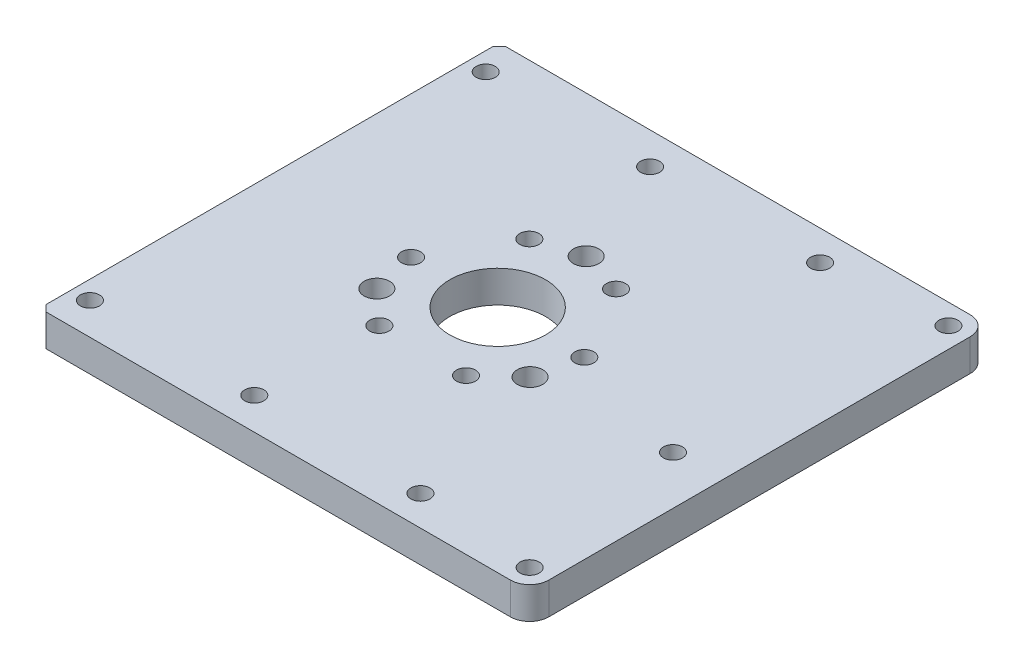
ISO-10303-21;
HEADER;
FILE_DESCRIPTION(('STEP AP214'),'2;1');
FILE_NAME('part.step','',(''),(''),'','','');
FILE_SCHEMA(('AUTOMOTIVE_DESIGN { 1 0 10303 214 1 1 1 1 }'));
ENDSEC;
DATA;
#1=APPLICATION_CONTEXT('core data for automotive mechanical design processes');
#2=APPLICATION_PROTOCOL_DEFINITION('international standard','automotive_design',2000,#1);
#3=PRODUCT_CONTEXT('',#1,'mechanical');
#4=PRODUCT('Part','Part','',(#3));
#5=PRODUCT_RELATED_PRODUCT_CATEGORY('part','',(#4));
#6=PRODUCT_DEFINITION_FORMATION('','',#4);
#7=PRODUCT_DEFINITION_CONTEXT('part definition',#1,'design');
#8=PRODUCT_DEFINITION('design','',#6,#7);
#9=PRODUCT_DEFINITION_SHAPE('','',#8);
#10=(LENGTH_UNIT() NAMED_UNIT(*) SI_UNIT(.MILLI.,.METRE.));
#11=(NAMED_UNIT(*) PLANE_ANGLE_UNIT() SI_UNIT($,.RADIAN.));
#12=(NAMED_UNIT(*) SI_UNIT($,.STERADIAN.) SOLID_ANGLE_UNIT());
#13=UNCERTAINTY_MEASURE_WITH_UNIT(LENGTH_MEASURE(1.E-05),#10,'distance_accuracy_value','');
#14=(GEOMETRIC_REPRESENTATION_CONTEXT(3) GLOBAL_UNCERTAINTY_ASSIGNED_CONTEXT((#13)) GLOBAL_UNIT_ASSIGNED_CONTEXT((#10,
#11,#12)) REPRESENTATION_CONTEXT('',''));
#15=CARTESIAN_POINT('',(0.,0.,0.));
#16=DIRECTION('',(0.,0.,1.));
#17=DIRECTION('',(1.,0.,0.));
#18=AXIS2_PLACEMENT_3D('',#15,#16,#17);
#19=CARTESIAN_POINT('',(-7.12499999999952,0.,31.0000000000006));
#20=DIRECTION('',(0.,1.,0.));
#21=DIRECTION('',(0.,0.,1.));
#22=AXIS2_PLACEMENT_3D('',#19,#20,#21);
#23=CYLINDRICAL_SURFACE('',#22,1.50000000009223);
#24=CARTESIAN_POINT('',(-7.12499999999952,5.,31.0000000000006));
#25=DIRECTION('',(0.,1.,0.));
#26=DIRECTION('',(0.,0.,1.));
#27=AXIS2_PLACEMENT_3D('',#24,#25,#26);
#28=CIRCLE('',#27,1.50000000009223);
#29=CARTESIAN_POINT('',(-7.12499999999952,5.,32.5000000000928));
#30=VERTEX_POINT('',#29);
#31=EDGE_CURVE('E285',#30,#30,#28,.T.);
#32=ORIENTED_EDGE('',*,*,#31,.T.);
#33=EDGE_LOOP('',(#32));
#34=FACE_BOUND('',#33,.T.);
#35=CARTESIAN_POINT('',(-7.12499999999952,1.7,31.0000000000006));
#36=DIRECTION('',(0.,-1.,0.));
#37=DIRECTION('',(0.,0.,-1.));
#38=AXIS2_PLACEMENT_3D('',#35,#36,#37);
#39=CIRCLE('',#38,1.50000000009223);
#40=CARTESIAN_POINT('',(-7.12499999999952,1.7,29.4999999999084));
#41=VERTEX_POINT('',#40);
#42=EDGE_CURVE('E39',#41,#41,#39,.F.);
#43=ORIENTED_EDGE('',*,*,#42,.F.);
#44=EDGE_LOOP('',(#43));
#45=FACE_BOUND('',#44,.T.);
#46=ADVANCED_FACE('F35',(#34,#45),#23,.F.);
#47=CARTESIAN_POINT('',(-7.12499999999935,0.,-30.9999999999992));
#48=DIRECTION('',(0.,1.,0.));
#49=DIRECTION('',(0.,0.,1.));
#50=AXIS2_PLACEMENT_3D('',#47,#48,#49);
#51=CYLINDRICAL_SURFACE('',#50,1.50000000008457);
#52=CARTESIAN_POINT('',(-7.12499999999935,5.,-30.9999999999992));
#53=DIRECTION('',(0.,1.,0.));
#54=DIRECTION('',(0.,0.,1.));
#55=AXIS2_PLACEMENT_3D('',#52,#53,#54);
#56=CIRCLE('',#55,1.50000000008457);
#57=CARTESIAN_POINT('',(-7.12499999999935,5.,-29.4999999999146));
#58=VERTEX_POINT('',#57);
#59=EDGE_CURVE('E138',#58,#58,#56,.T.);
#60=ORIENTED_EDGE('',*,*,#59,.T.);
#61=EDGE_LOOP('',(#60));
#62=FACE_BOUND('',#61,.T.);
#63=CARTESIAN_POINT('',(-7.12499999999935,1.7,-30.9999999999992));
#64=DIRECTION('',(0.,-1.,0.));
#65=DIRECTION('',(0.,0.,-1.));
#66=AXIS2_PLACEMENT_3D('',#63,#64,#65);
#67=CIRCLE('',#66,1.50000000008457);
#68=CARTESIAN_POINT('',(-7.12499999999935,1.7,-32.5000000000838));
#69=VERTEX_POINT('',#68);
#70=EDGE_CURVE('E246',#69,#69,#67,.F.);
#71=ORIENTED_EDGE('',*,*,#70,.F.);
#72=EDGE_LOOP('',(#71));
#73=FACE_BOUND('',#72,.T.);
#74=ADVANCED_FACE('F318',(#62,#73),#51,.F.);
#75=CARTESIAN_POINT('',(0.,5.,0.));
#76=DIRECTION('',(0.,1.,0.));
#77=DIRECTION('',(0.,0.,1.));
#78=AXIS2_PLACEMENT_3D('',#75,#76,#77);
#79=PLANE('',#78);
#80=CARTESIAN_POINT('',(19.2,5.,31.2999999999999));
#81=DIRECTION('',(0.,-1.,0.));
#82=DIRECTION('',(0.,0.,-1.));
#83=AXIS2_PLACEMENT_3D('',#80,#81,#82);
#84=CIRCLE('',#83,1.50000000000013);
#85=CARTESIAN_POINT('',(19.2,5.,29.7999999999998));
#86=VERTEX_POINT('',#85);
#87=EDGE_CURVE('E252',#86,#86,#84,.T.);
#88=ORIENTED_EDGE('',*,*,#87,.T.);
#89=EDGE_LOOP('',(#88));
#90=FACE_BOUND('',#89,.T.);
#91=CARTESIAN_POINT('',(37.8000000000003,5.,32.7999999999999));
#92=DIRECTION('',(0.,-1.,0.));
#93=DIRECTION('',(0.,0.,-1.));
#94=AXIS2_PLACEMENT_3D('',#91,#92,#93);
#95=CIRCLE('',#94,1.50000000000013);
#96=CARTESIAN_POINT('',(37.8000000000003,5.,31.2999999999998));
#97=VERTEX_POINT('',#96);
#98=EDGE_CURVE('E273',#97,#97,#95,.T.);
#99=ORIENTED_EDGE('',*,*,#98,.T.);
#100=EDGE_LOOP('',(#99));
#101=FACE_BOUND('',#100,.T.);
#102=CARTESIAN_POINT('',(33.412894333473,5.,5.9521226666585));
#103=DIRECTION('',(0.,-1.,0.));
#104=DIRECTION('',(0.,0.,-1.));
#105=AXIS2_PLACEMENT_3D('',#102,#103,#104);
#106=CIRCLE('',#105,1.50000000000014);
#107=CARTESIAN_POINT('',(33.412894333473,5.,4.45212266665836));
#108=VERTEX_POINT('',#107);
#109=EDGE_CURVE('E270',#108,#108,#106,.T.);
#110=ORIENTED_EDGE('',*,*,#109,.T.);
#111=EDGE_LOOP('',(#110));
#112=FACE_BOUND('',#111,.T.);
#113=CARTESIAN_POINT('',(19.2,5.,-31.3000000000003));
#114=DIRECTION('',(0.,-1.,0.));
#115=DIRECTION('',(0.,0.,-1.));
#116=AXIS2_PLACEMENT_3D('',#113,#114,#115);
#117=CIRCLE('',#116,1.50000000000014);
#118=CARTESIAN_POINT('',(19.2,5.,-32.8000000000004));
#119=VERTEX_POINT('',#118);
#120=EDGE_CURVE('E267',#119,#119,#117,.T.);
#121=ORIENTED_EDGE('',*,*,#120,.T.);
#122=EDGE_LOOP('',(#121));
#123=FACE_BOUND('',#122,.T.);
#124=CARTESIAN_POINT('',(37.8000000000003,5.,-32.8000000000003));
#125=DIRECTION('',(0.,-1.,0.));
#126=DIRECTION('',(0.,0.,-1.));
#127=AXIS2_PLACEMENT_3D('',#124,#125,#126);
#128=CIRCLE('',#127,1.50000000000014);
#129=CARTESIAN_POINT('',(37.8000000000003,5.,-34.3000000000004));
#130=VERTEX_POINT('',#129);
#131=EDGE_CURVE('E234',#130,#130,#128,.T.);
#132=ORIENTED_EDGE('',*,*,#131,.T.);
#133=EDGE_LOOP('',(#132));
#134=FACE_BOUND('',#133,.T.);
#135=CARTESIAN_POINT('',(-32.8749999999995,5.,31.0000000000007));
#136=DIRECTION('',(0.,1.,0.));
#137=DIRECTION('',(0.,0.,1.));
#138=AXIS2_PLACEMENT_3D('',#135,#136,#137);
#139=CIRCLE('',#138,1.50000000010407);
#140=CARTESIAN_POINT('',(-32.8749999999995,5.,32.5000000001048));
#141=VERTEX_POINT('',#140);
#142=EDGE_CURVE('E134',#141,#141,#139,.T.);
#143=ORIENTED_EDGE('',*,*,#142,.F.);
#144=EDGE_LOOP('',(#143));
#145=FACE_BOUND('',#144,.T.);
#146=ORIENTED_EDGE('',*,*,#59,.F.);
#147=EDGE_LOOP('',(#146));
#148=FACE_BOUND('',#147,.T.);
#149=CARTESIAN_POINT('',(-32.8749999999993,5.,-30.9999999999991));
#150=DIRECTION('',(0.,1.,0.));
#151=DIRECTION('',(0.,0.,1.));
#152=AXIS2_PLACEMENT_3D('',#149,#150,#151);
#153=CIRCLE('',#152,1.50000000009641);
#154=CARTESIAN_POINT('',(-32.8749999999993,5.,-29.4999999999027));
#155=VERTEX_POINT('',#154);
#156=EDGE_CURVE('E288',#155,#155,#153,.T.);
#157=ORIENTED_EDGE('',*,*,#156,.F.);
#158=EDGE_LOOP('',(#157));
#159=FACE_BOUND('',#158,.T.);
#160=ORIENTED_EDGE('',*,*,#31,.F.);
#161=EDGE_LOOP('',(#160));
#162=FACE_BOUND('',#161,.T.);
#163=DIRECTION('',(-0.707106781186547,0.,0.707106781186547));
#164=VECTOR('',#163,1.);
#165=CARTESIAN_POINT('',(-34.7500000000002,5.,-36.));
#166=LINE('',#165,#164);
#167=CARTESIAN_POINT('',(-34.7500000000002,5.,-36.));
#168=VERTEX_POINT('',#167);
#169=CARTESIAN_POINT('',(-35.7500000000002,5.,-35.));
#170=VERTEX_POINT('',#169);
#171=EDGE_CURVE('E115',#168,#170,#166,.T.);
#172=ORIENTED_EDGE('',*,*,#171,.T.);
#173=DIRECTION('',(0.,0.,1.));
#174=VECTOR('',#173,1.);
#175=CARTESIAN_POINT('',(-35.7500000000002,5.,-35.));
#176=LINE('',#175,#174);
#177=CARTESIAN_POINT('',(-35.7500000000002,5.,35.));
#178=VERTEX_POINT('',#177);
#179=EDGE_CURVE('E133',#170,#178,#176,.T.);
#180=ORIENTED_EDGE('',*,*,#179,.T.);
#181=DIRECTION('',(0.707106781186547,0.,0.707106781186547));
#182=VECTOR('',#181,1.);
#183=CARTESIAN_POINT('',(-34.7500000000002,5.,36.));
#184=LINE('',#183,#182);
#185=CARTESIAN_POINT('',(-34.7500000000002,5.,36.));
#186=VERTEX_POINT('',#185);
#187=EDGE_CURVE('E128',#178,#186,#184,.T.);
#188=ORIENTED_EDGE('',*,*,#187,.T.);
#189=DIRECTION('',(1.,0.,0.));
#190=VECTOR('',#189,1.);
#191=CARTESIAN_POINT('',(38.,5.,36.));
#192=LINE('',#191,#190);
#193=CARTESIAN_POINT('',(38.,5.,36.));
#194=VERTEX_POINT('',#193);
#195=EDGE_CURVE('E85',#186,#194,#192,.T.);
#196=ORIENTED_EDGE('',*,*,#195,.T.);
#197=CARTESIAN_POINT('',(38.,5.,33.));
#198=DIRECTION('',(0.,1.,0.));
#199=DIRECTION('',(0.,0.,-1.));
#200=AXIS2_PLACEMENT_3D('',#197,#198,#199);
#201=CIRCLE('',#200,3.);
#202=CARTESIAN_POINT('',(41.,5.,33.));
#203=VERTEX_POINT('',#202);
#204=EDGE_CURVE('E215',#194,#203,#201,.T.);
#205=ORIENTED_EDGE('',*,*,#204,.T.);
#206=DIRECTION('',(0.,0.,-1.));
#207=VECTOR('',#206,1.);
#208=CARTESIAN_POINT('',(41.,5.,-33.));
#209=LINE('',#208,#207);
#210=CARTESIAN_POINT('',(41.,5.,-33.));
#211=VERTEX_POINT('',#210);
#212=EDGE_CURVE('E217',#203,#211,#209,.T.);
#213=ORIENTED_EDGE('',*,*,#212,.T.);
#214=CARTESIAN_POINT('',(38.,5.,-33.));
#215=DIRECTION('',(0.,1.,0.));
#216=DIRECTION('',(0.,0.,-1.));
#217=AXIS2_PLACEMENT_3D('',#214,#215,#216);
#218=CIRCLE('',#217,3.);
#219=CARTESIAN_POINT('',(38.,5.,-36.));
#220=VERTEX_POINT('',#219);
#221=EDGE_CURVE('E54',#211,#220,#218,.T.);
#222=ORIENTED_EDGE('',*,*,#221,.T.);
#223=DIRECTION('',(-1.,0.,0.));
#224=VECTOR('',#223,1.);
#225=CARTESIAN_POINT('',(0.,5.,-36.));
#226=LINE('',#225,#224);
#227=EDGE_CURVE('E110',#220,#168,#226,.T.);
#228=ORIENTED_EDGE('',*,*,#227,.T.);
#229=EDGE_LOOP('',(#172,#180,#188,#196,#205,#213,#222,#228));
#230=FACE_BOUND('',#229,.T.);
#231=CARTESIAN_POINT('',(0.,5.,-13.856406460551));
#232=DIRECTION('',(0.,1.,0.));
#233=DIRECTION('',(0.,0.,1.));
#234=AXIS2_PLACEMENT_3D('',#231,#232,#233);
#235=CIRCLE('',#234,2.);
#236=CARTESIAN_POINT('',(0.,5.,-11.856406460551));
#237=VERTEX_POINT('',#236);
#238=EDGE_CURVE('E160',#237,#237,#235,.T.);
#239=ORIENTED_EDGE('',*,*,#238,.F.);
#240=EDGE_LOOP('',(#239));
#241=FACE_BOUND('',#240,.T.);
#242=CARTESIAN_POINT('',(-13.5677313259562,5.,0.));
#243=DIRECTION('',(0.,1.,0.));
#244=DIRECTION('',(0.,0.,1.));
#245=AXIS2_PLACEMENT_3D('',#242,#243,#244);
#246=CIRCLE('',#245,1.5);
#247=CARTESIAN_POINT('',(-13.5677313259562,5.,1.5));
#248=VERTEX_POINT('',#247);
#249=EDGE_CURVE('E172',#248,#248,#246,.T.);
#250=ORIENTED_EDGE('',*,*,#249,.F.);
#251=EDGE_LOOP('',(#250));
#252=FACE_BOUND('',#251,.T.);
#253=CARTESIAN_POINT('',(6.7838656629781,5.,11.75));
#254=DIRECTION('',(0.,1.,0.));
#255=DIRECTION('',(0.,0.,1.));
#256=AXIS2_PLACEMENT_3D('',#253,#254,#255);
#257=CIRCLE('',#256,1.5);
#258=CARTESIAN_POINT('',(6.7838656629781,5.,13.25));
#259=VERTEX_POINT('',#258);
#260=EDGE_CURVE('E184',#259,#259,#257,.T.);
#261=ORIENTED_EDGE('',*,*,#260,.F.);
#262=EDGE_LOOP('',(#261));
#263=FACE_BOUND('',#262,.T.);
#264=CARTESIAN_POINT('',(6.7838656629781,5.,-11.75));
#265=DIRECTION('',(0.,1.,0.));
#266=DIRECTION('',(0.,0.,1.));
#267=AXIS2_PLACEMENT_3D('',#264,#265,#266);
#268=CIRCLE('',#267,1.5);
#269=CARTESIAN_POINT('',(6.7838656629781,5.,-10.25));
#270=VERTEX_POINT('',#269);
#271=EDGE_CURVE('E196',#270,#270,#268,.T.);
#272=ORIENTED_EDGE('',*,*,#271,.F.);
#273=EDGE_LOOP('',(#272));
#274=FACE_BOUND('',#273,.T.);
#275=CARTESIAN_POINT('',(0.,5.,0.));
#276=DIRECTION('',(0.,1.,0.));
#277=DIRECTION('',(0.,0.,1.));
#278=AXIS2_PLACEMENT_3D('',#275,#276,#277);
#279=CIRCLE('',#278,7.5);
#280=CARTESIAN_POINT('',(0.,5.,7.5));
#281=VERTEX_POINT('',#280);
#282=EDGE_CURVE('E208',#281,#281,#279,.T.);
#283=ORIENTED_EDGE('',*,*,#282,.F.);
#284=EDGE_LOOP('',(#283));
#285=FACE_BOUND('',#284,.T.);
#286=CARTESIAN_POINT('',(-6.7838656629781,5.,-11.75));
#287=DIRECTION('',(0.,1.,0.));
#288=DIRECTION('',(0.,0.,1.));
#289=AXIS2_PLACEMENT_3D('',#286,#287,#288);
#290=CIRCLE('',#289,1.5);
#291=CARTESIAN_POINT('',(-6.7838656629781,5.,-10.25));
#292=VERTEX_POINT('',#291);
#293=EDGE_CURVE('E202',#292,#292,#290,.T.);
#294=ORIENTED_EDGE('',*,*,#293,.F.);
#295=EDGE_LOOP('',(#294));
#296=FACE_BOUND('',#295,.T.);
#297=CARTESIAN_POINT('',(13.5677313259562,5.,0.));
#298=DIRECTION('',(0.,1.,0.));
#299=DIRECTION('',(0.,0.,1.));
#300=AXIS2_PLACEMENT_3D('',#297,#298,#299);
#301=CIRCLE('',#300,1.5);
#302=CARTESIAN_POINT('',(13.5677313259562,5.,1.49999999999999));
#303=VERTEX_POINT('',#302);
#304=EDGE_CURVE('E190',#303,#303,#301,.T.);
#305=ORIENTED_EDGE('',*,*,#304,.F.);
#306=EDGE_LOOP('',(#305));
#307=FACE_BOUND('',#306,.T.);
#308=CARTESIAN_POINT('',(-6.7838656629781,5.,11.75));
#309=DIRECTION('',(0.,1.,0.));
#310=DIRECTION('',(0.,0.,1.));
#311=AXIS2_PLACEMENT_3D('',#308,#309,#310);
#312=CIRCLE('',#311,1.5);
#313=CARTESIAN_POINT('',(-6.7838656629781,5.,13.25));
#314=VERTEX_POINT('',#313);
#315=EDGE_CURVE('E178',#314,#314,#312,.T.);
#316=ORIENTED_EDGE('',*,*,#315,.F.);
#317=EDGE_LOOP('',(#316));
#318=FACE_BOUND('',#317,.T.);
#319=CARTESIAN_POINT('',(-12.,5.,6.92820323027551));
#320=DIRECTION('',(0.,1.,0.));
#321=DIRECTION('',(0.,0.,1.));
#322=AXIS2_PLACEMENT_3D('',#319,#320,#321);
#323=CIRCLE('',#322,2.);
#324=CARTESIAN_POINT('',(-12.,5.,8.92820323027551));
#325=VERTEX_POINT('',#324);
#326=EDGE_CURVE('E166',#325,#325,#323,.T.);
#327=ORIENTED_EDGE('',*,*,#326,.F.);
#328=EDGE_LOOP('',(#327));
#329=FACE_BOUND('',#328,.T.);
#330=CARTESIAN_POINT('',(12.,5.,6.92820323027551));
#331=DIRECTION('',(0.,1.,0.));
#332=DIRECTION('',(0.,0.,1.));
#333=AXIS2_PLACEMENT_3D('',#330,#331,#332);
#334=CIRCLE('',#333,2.);
#335=CARTESIAN_POINT('',(12.,5.,8.92820323027551));
#336=VERTEX_POINT('',#335);
#337=EDGE_CURVE('E153',#336,#336,#334,.T.);
#338=ORIENTED_EDGE('',*,*,#337,.F.);
#339=EDGE_LOOP('',(#338));
#340=FACE_BOUND('',#339,.T.);
#341=ADVANCED_FACE('F112',(#90,#101,#112,#123,#134,#145,#148,#159,#162,#230,#241,#252,#263,#274,
#285,#296,#307,#318,#329,#340),#79,.T.);
#342=CARTESIAN_POINT('',(0.,0.,0.));
#343=DIRECTION('',(0.,1.,0.));
#344=DIRECTION('',(0.,0.,1.));
#345=AXIS2_PLACEMENT_3D('',#342,#343,#344);
#346=PLANE('',#345);
#347=CARTESIAN_POINT('',(-7.12499999999952,0.,31.0000000000006));
#348=DIRECTION('',(0.,-1.,0.));
#349=DIRECTION('',(0.,0.,-1.));
#350=AXIS2_PLACEMENT_3D('',#347,#348,#349);
#351=CIRCLE('',#350,3.);
#352=CARTESIAN_POINT('',(-7.12499999999952,0.,28.0000000000006));
#353=VERTEX_POINT('',#352);
#354=EDGE_CURVE('E254',#353,#353,#351,.T.);
#355=ORIENTED_EDGE('',*,*,#354,.F.);
#356=EDGE_LOOP('',(#355));
#357=FACE_BOUND('',#356,.T.);
#358=CARTESIAN_POINT('',(-7.12499999999935,0.,-30.9999999999992));
#359=DIRECTION('',(0.,-1.,0.));
#360=DIRECTION('',(0.,0.,-1.));
#361=AXIS2_PLACEMENT_3D('',#358,#359,#360);
#362=CIRCLE('',#361,3.);
#363=CARTESIAN_POINT('',(-7.12499999999935,0.,-33.9999999999992));
#364=VERTEX_POINT('',#363);
#365=EDGE_CURVE('E264',#364,#364,#362,.T.);
#366=ORIENTED_EDGE('',*,*,#365,.F.);
#367=EDGE_LOOP('',(#366));
#368=FACE_BOUND('',#367,.T.);
#369=CARTESIAN_POINT('',(19.2,0.,31.2999999999999));
#370=DIRECTION('',(0.,1.,0.));
#371=DIRECTION('',(0.,0.,1.));
#372=AXIS2_PLACEMENT_3D('',#369,#370,#371);
#373=CIRCLE('',#372,1.50000000000013);
#374=CARTESIAN_POINT('',(19.2,0.,32.8000000000001));
#375=VERTEX_POINT('',#374);
#376=EDGE_CURVE('E243',#375,#375,#373,.T.);
#377=ORIENTED_EDGE('',*,*,#376,.T.);
#378=EDGE_LOOP('',(#377));
#379=FACE_BOUND('',#378,.T.);
#380=CARTESIAN_POINT('',(37.8000000000003,0.,32.7999999999999));
#381=DIRECTION('',(0.,1.,0.));
#382=DIRECTION('',(0.,0.,1.));
#383=AXIS2_PLACEMENT_3D('',#380,#381,#382);
#384=CIRCLE('',#383,1.50000000000013);
#385=CARTESIAN_POINT('',(37.8000000000003,0.,34.3000000000001));
#386=VERTEX_POINT('',#385);
#387=EDGE_CURVE('E240',#386,#386,#384,.T.);
#388=ORIENTED_EDGE('',*,*,#387,.T.);
#389=EDGE_LOOP('',(#388));
#390=FACE_BOUND('',#389,.T.);
#391=CARTESIAN_POINT('',(33.412894333473,0.,5.9521226666585));
#392=DIRECTION('',(0.,1.,0.));
#393=DIRECTION('',(0.,0.,1.));
#394=AXIS2_PLACEMENT_3D('',#391,#392,#393);
#395=CIRCLE('',#394,1.50000000000014);
#396=CARTESIAN_POINT('',(33.412894333473,0.,7.45212266665864));
#397=VERTEX_POINT('',#396);
#398=EDGE_CURVE('E237',#397,#397,#395,.T.);
#399=ORIENTED_EDGE('',*,*,#398,.T.);
#400=EDGE_LOOP('',(#399));
#401=FACE_BOUND('',#400,.T.);
#402=CARTESIAN_POINT('',(19.2,0.,-31.3000000000003));
#403=DIRECTION('',(0.,1.,0.));
#404=DIRECTION('',(0.,0.,1.));
#405=AXIS2_PLACEMENT_3D('',#402,#403,#404);
#406=CIRCLE('',#405,1.50000000000014);
#407=CARTESIAN_POINT('',(19.2,0.,-29.8000000000001));
#408=VERTEX_POINT('',#407);
#409=EDGE_CURVE('E233',#408,#408,#406,.T.);
#410=ORIENTED_EDGE('',*,*,#409,.T.);
#411=EDGE_LOOP('',(#410));
#412=FACE_BOUND('',#411,.T.);
#413=CARTESIAN_POINT('',(37.8000000000003,0.,-32.8000000000003));
#414=DIRECTION('',(0.,1.,0.));
#415=DIRECTION('',(0.,0.,1.));
#416=AXIS2_PLACEMENT_3D('',#413,#414,#415);
#417=CIRCLE('',#416,1.50000000000014);
#418=CARTESIAN_POINT('',(37.8000000000003,0.,-31.3000000000001));
#419=VERTEX_POINT('',#418);
#420=EDGE_CURVE('E230',#419,#419,#417,.T.);
#421=ORIENTED_EDGE('',*,*,#420,.T.);
#422=EDGE_LOOP('',(#421));
#423=FACE_BOUND('',#422,.T.);
#424=CARTESIAN_POINT('',(-32.8749999999995,0.,31.0000000000007));
#425=DIRECTION('',(0.,1.,0.));
#426=DIRECTION('',(0.,0.,1.));
#427=AXIS2_PLACEMENT_3D('',#424,#425,#426);
#428=CIRCLE('',#427,1.50000000010407);
#429=CARTESIAN_POINT('',(-32.8749999999995,0.,32.5000000001048));
#430=VERTEX_POINT('',#429);
#431=EDGE_CURVE('E282',#430,#430,#428,.T.);
#432=ORIENTED_EDGE('',*,*,#431,.T.);
#433=EDGE_LOOP('',(#432));
#434=FACE_BOUND('',#433,.T.);
#435=CARTESIAN_POINT('',(-32.8749999999993,0.,-30.9999999999991));
#436=DIRECTION('',(0.,1.,0.));
#437=DIRECTION('',(0.,0.,1.));
#438=AXIS2_PLACEMENT_3D('',#435,#436,#437);
#439=CIRCLE('',#438,1.50000000009641);
#440=CARTESIAN_POINT('',(-32.8749999999993,0.,-29.4999999999027));
#441=VERTEX_POINT('',#440);
#442=EDGE_CURVE('E245',#441,#441,#439,.T.);
#443=ORIENTED_EDGE('',*,*,#442,.T.);
#444=EDGE_LOOP('',(#443));
#445=FACE_BOUND('',#444,.T.);
#446=DIRECTION('',(-0.707106781186548,0.,-0.707106781186548));
#447=VECTOR('',#446,1.);
#448=CARTESIAN_POINT('',(-34.7500000000002,0.,36.));
#449=LINE('',#448,#447);
#450=CARTESIAN_POINT('',(-34.7500000000002,0.,36.));
#451=VERTEX_POINT('',#450);
#452=CARTESIAN_POINT('',(-35.7500000000002,0.,35.));
#453=VERTEX_POINT('',#452);
#454=EDGE_CURVE('E141',#451,#453,#449,.T.);
#455=ORIENTED_EDGE('',*,*,#454,.T.);
#456=DIRECTION('',(0.,0.,-1.));
#457=VECTOR('',#456,1.);
#458=CARTESIAN_POINT('',(-35.7500000000002,0.,-35.));
#459=LINE('',#458,#457);
#460=CARTESIAN_POINT('',(-35.7500000000002,0.,-35.));
#461=VERTEX_POINT('',#460);
#462=EDGE_CURVE('E293',#453,#461,#459,.T.);
#463=ORIENTED_EDGE('',*,*,#462,.T.);
#464=DIRECTION('',(0.707106781186548,0.,-0.707106781186548));
#465=VECTOR('',#464,1.);
#466=CARTESIAN_POINT('',(-34.7500000000002,0.,-36.));
#467=LINE('',#466,#465);
#468=CARTESIAN_POINT('',(-34.7500000000002,0.,-36.));
#469=VERTEX_POINT('',#468);
#470=EDGE_CURVE('E148',#461,#469,#467,.T.);
#471=ORIENTED_EDGE('',*,*,#470,.T.);
#472=DIRECTION('',(-1.,0.,0.));
#473=VECTOR('',#472,1.);
#474=CARTESIAN_POINT('',(0.,0.,-36.));
#475=LINE('',#474,#473);
#476=CARTESIAN_POINT('',(38.,0.,-36.));
#477=VERTEX_POINT('',#476);
#478=EDGE_CURVE('E123',#477,#469,#475,.T.);
#479=ORIENTED_EDGE('',*,*,#478,.F.);
#480=CARTESIAN_POINT('',(38.,0.,-33.));
#481=DIRECTION('',(0.,1.,0.));
#482=DIRECTION('',(0.,0.,-1.));
#483=AXIS2_PLACEMENT_3D('',#480,#481,#482);
#484=CIRCLE('',#483,3.);
#485=CARTESIAN_POINT('',(41.,0.,-33.));
#486=VERTEX_POINT('',#485);
#487=EDGE_CURVE('E78',#486,#477,#484,.T.);
#488=ORIENTED_EDGE('',*,*,#487,.F.);
#489=DIRECTION('',(0.,0.,-1.));
#490=VECTOR('',#489,1.);
#491=CARTESIAN_POINT('',(41.,0.,-33.));
#492=LINE('',#491,#490);
#493=CARTESIAN_POINT('',(41.,0.,33.));
#494=VERTEX_POINT('',#493);
#495=EDGE_CURVE('E72',#494,#486,#492,.T.);
#496=ORIENTED_EDGE('',*,*,#495,.F.);
#497=CARTESIAN_POINT('',(38.,0.,33.));
#498=DIRECTION('',(0.,1.,0.));
#499=DIRECTION('',(0.,0.,-1.));
#500=AXIS2_PLACEMENT_3D('',#497,#498,#499);
#501=CIRCLE('',#500,3.);
#502=CARTESIAN_POINT('',(38.,0.,36.));
#503=VERTEX_POINT('',#502);
#504=EDGE_CURVE('E221',#503,#494,#501,.T.);
#505=ORIENTED_EDGE('',*,*,#504,.F.);
#506=DIRECTION('',(1.,0.,0.));
#507=VECTOR('',#506,1.);
#508=CARTESIAN_POINT('',(38.,0.,36.));
#509=LINE('',#508,#507);
#510=EDGE_CURVE('E211',#451,#503,#509,.T.);
#511=ORIENTED_EDGE('',*,*,#510,.F.);
#512=EDGE_LOOP('',(#455,#463,#471,#479,#488,#496,#505,#511));
#513=FACE_BOUND('',#512,.T.);
#514=CARTESIAN_POINT('',(12.,0.,6.92820323027551));
#515=DIRECTION('',(0.,1.,0.));
#516=DIRECTION('',(0.,0.,1.));
#517=AXIS2_PLACEMENT_3D('',#514,#515,#516);
#518=CIRCLE('',#517,2.);
#519=CARTESIAN_POINT('',(12.,0.,8.92820323027551));
#520=VERTEX_POINT('',#519);
#521=EDGE_CURVE('E157',#520,#520,#518,.T.);
#522=ORIENTED_EDGE('',*,*,#521,.T.);
#523=EDGE_LOOP('',(#522));
#524=FACE_BOUND('',#523,.T.);
#525=CARTESIAN_POINT('',(0.,0.,-13.856406460551));
#526=DIRECTION('',(0.,1.,0.));
#527=DIRECTION('',(0.,0.,1.));
#528=AXIS2_PLACEMENT_3D('',#525,#526,#527);
#529=CIRCLE('',#528,2.);
#530=CARTESIAN_POINT('',(0.,0.,-11.856406460551));
#531=VERTEX_POINT('',#530);
#532=EDGE_CURVE('E156',#531,#531,#529,.T.);
#533=ORIENTED_EDGE('',*,*,#532,.T.);
#534=EDGE_LOOP('',(#533));
#535=FACE_BOUND('',#534,.T.);
#536=CARTESIAN_POINT('',(-12.,0.,6.92820323027551));
#537=DIRECTION('',(0.,1.,0.));
#538=DIRECTION('',(0.,0.,1.));
#539=AXIS2_PLACEMENT_3D('',#536,#537,#538);
#540=CIRCLE('',#539,2.);
#541=CARTESIAN_POINT('',(-12.,0.,8.92820323027551));
#542=VERTEX_POINT('',#541);
#543=EDGE_CURVE('E163',#542,#542,#540,.T.);
#544=ORIENTED_EDGE('',*,*,#543,.T.);
#545=EDGE_LOOP('',(#544));
#546=FACE_BOUND('',#545,.T.);
#547=CARTESIAN_POINT('',(-13.5677313259562,0.,0.));
#548=DIRECTION('',(0.,1.,0.));
#549=DIRECTION('',(0.,0.,1.));
#550=AXIS2_PLACEMENT_3D('',#547,#548,#549);
#551=CIRCLE('',#550,1.5);
#552=CARTESIAN_POINT('',(-13.5677313259562,0.,1.5));
#553=VERTEX_POINT('',#552);
#554=EDGE_CURVE('E169',#553,#553,#551,.T.);
#555=ORIENTED_EDGE('',*,*,#554,.T.);
#556=EDGE_LOOP('',(#555));
#557=FACE_BOUND('',#556,.T.);
#558=CARTESIAN_POINT('',(-6.7838656629781,0.,11.75));
#559=DIRECTION('',(0.,1.,0.));
#560=DIRECTION('',(0.,0.,1.));
#561=AXIS2_PLACEMENT_3D('',#558,#559,#560);
#562=CIRCLE('',#561,1.5);
#563=CARTESIAN_POINT('',(-6.7838656629781,0.,13.25));
#564=VERTEX_POINT('',#563);
#565=EDGE_CURVE('E175',#564,#564,#562,.T.);
#566=ORIENTED_EDGE('',*,*,#565,.T.);
#567=EDGE_LOOP('',(#566));
#568=FACE_BOUND('',#567,.T.);
#569=CARTESIAN_POINT('',(6.7838656629781,0.,11.75));
#570=DIRECTION('',(0.,1.,0.));
#571=DIRECTION('',(0.,0.,1.));
#572=AXIS2_PLACEMENT_3D('',#569,#570,#571);
#573=CIRCLE('',#572,1.5);
#574=CARTESIAN_POINT('',(6.7838656629781,0.,13.25));
#575=VERTEX_POINT('',#574);
#576=EDGE_CURVE('E181',#575,#575,#573,.T.);
#577=ORIENTED_EDGE('',*,*,#576,.T.);
#578=EDGE_LOOP('',(#577));
#579=FACE_BOUND('',#578,.T.);
#580=CARTESIAN_POINT('',(13.5677313259562,0.,0.));
#581=DIRECTION('',(0.,1.,0.));
#582=DIRECTION('',(0.,0.,1.));
#583=AXIS2_PLACEMENT_3D('',#580,#581,#582);
#584=CIRCLE('',#583,1.5);
#585=CARTESIAN_POINT('',(13.5677313259562,0.,1.49999999999999));
#586=VERTEX_POINT('',#585);
#587=EDGE_CURVE('E187',#586,#586,#584,.T.);
#588=ORIENTED_EDGE('',*,*,#587,.T.);
#589=EDGE_LOOP('',(#588));
#590=FACE_BOUND('',#589,.T.);
#591=CARTESIAN_POINT('',(6.7838656629781,0.,-11.75));
#592=DIRECTION('',(0.,1.,0.));
#593=DIRECTION('',(0.,0.,1.));
#594=AXIS2_PLACEMENT_3D('',#591,#592,#593);
#595=CIRCLE('',#594,1.5);
#596=CARTESIAN_POINT('',(6.7838656629781,0.,-10.25));
#597=VERTEX_POINT('',#596);
#598=EDGE_CURVE('E193',#597,#597,#595,.T.);
#599=ORIENTED_EDGE('',*,*,#598,.T.);
#600=EDGE_LOOP('',(#599));
#601=FACE_BOUND('',#600,.T.);
#602=CARTESIAN_POINT('',(-6.7838656629781,0.,-11.75));
#603=DIRECTION('',(0.,1.,0.));
#604=DIRECTION('',(0.,0.,1.));
#605=AXIS2_PLACEMENT_3D('',#602,#603,#604);
#606=CIRCLE('',#605,1.5);
#607=CARTESIAN_POINT('',(-6.7838656629781,0.,-10.25));
#608=VERTEX_POINT('',#607);
#609=EDGE_CURVE('E199',#608,#608,#606,.T.);
#610=ORIENTED_EDGE('',*,*,#609,.T.);
#611=EDGE_LOOP('',(#610));
#612=FACE_BOUND('',#611,.T.);
#613=CARTESIAN_POINT('',(0.,0.,0.));
#614=DIRECTION('',(0.,1.,0.));
#615=DIRECTION('',(0.,0.,1.));
#616=AXIS2_PLACEMENT_3D('',#613,#614,#615);
#617=CIRCLE('',#616,7.5);
#618=CARTESIAN_POINT('',(0.,0.,7.5));
#619=VERTEX_POINT('',#618);
#620=EDGE_CURVE('E205',#619,#619,#617,.T.);
#621=ORIENTED_EDGE('',*,*,#620,.T.);
#622=EDGE_LOOP('',(#621));
#623=FACE_BOUND('',#622,.T.);
#624=ADVANCED_FACE('F298',(#357,#368,#379,#390,#401,#412,#423,#434,#445,#513,#524,#535,#546,
#557,#568,#579,#590,#601,#612,#623),#346,.F.);
#625=CARTESIAN_POINT('',(38.,5.,36.));
#626=DIRECTION('',(0.,0.,-1.));
#627=DIRECTION('',(-1.,0.,0.));
#628=AXIS2_PLACEMENT_3D('',#625,#626,#627);
#629=PLANE('',#628);
#630=ORIENTED_EDGE('',*,*,#510,.T.);
#631=DIRECTION('',(0.,-1.,0.));
#632=VECTOR('',#631,1.);
#633=CARTESIAN_POINT('',(38.,5.,36.));
#634=LINE('',#633,#632);
#635=EDGE_CURVE('E11',#194,#503,#634,.T.);
#636=ORIENTED_EDGE('',*,*,#635,.F.);
#637=ORIENTED_EDGE('',*,*,#195,.F.);
#638=DIRECTION('',(0.,1.,0.));
#639=VECTOR('',#638,1.);
#640=CARTESIAN_POINT('',(-34.7500000000002,-80.386954787453,36.));
#641=LINE('',#640,#639);
#642=EDGE_CURVE('E145',#451,#186,#641,.T.);
#643=ORIENTED_EDGE('',*,*,#642,.F.);
#644=EDGE_LOOP('',(#630,#636,#637,#643));
#645=FACE_BOUND('',#644,.T.);
#646=ADVANCED_FACE('F37',(#645),#629,.F.);
#647=CARTESIAN_POINT('',(38.,5.,33.));
#648=DIRECTION('',(0.,-1.,0.));
#649=DIRECTION('',(0.,0.,-1.));
#650=AXIS2_PLACEMENT_3D('',#647,#648,#649);
#651=CYLINDRICAL_SURFACE('',#650,3.);
#652=ORIENTED_EDGE('',*,*,#504,.T.);
#653=DIRECTION('',(0.,-1.,0.));
#654=VECTOR('',#653,1.);
#655=CARTESIAN_POINT('',(41.,5.,33.));
#656=LINE('',#655,#654);
#657=EDGE_CURVE('E45',#203,#494,#656,.T.);
#658=ORIENTED_EDGE('',*,*,#657,.F.);
#659=ORIENTED_EDGE('',*,*,#204,.F.);
#660=ORIENTED_EDGE('',*,*,#635,.T.);
#661=EDGE_LOOP('',(#652,#658,#659,#660));
#662=FACE_BOUND('',#661,.T.);
#663=ADVANCED_FACE('F479',(#662),#651,.T.);
#664=CARTESIAN_POINT('',(41.,5.,-33.));
#665=DIRECTION('',(-1.,0.,0.));
#666=DIRECTION('',(0.,0.,1.));
#667=AXIS2_PLACEMENT_3D('',#664,#665,#666);
#668=PLANE('',#667);
#669=ORIENTED_EDGE('',*,*,#495,.T.);
#670=DIRECTION('',(0.,-1.,0.));
#671=VECTOR('',#670,1.);
#672=CARTESIAN_POINT('',(41.,5.,-33.));
#673=LINE('',#672,#671);
#674=EDGE_CURVE('E227',#211,#486,#673,.T.);
#675=ORIENTED_EDGE('',*,*,#674,.F.);
#676=ORIENTED_EDGE('',*,*,#212,.F.);
#677=ORIENTED_EDGE('',*,*,#657,.T.);
#678=EDGE_LOOP('',(#669,#675,#676,#677));
#679=FACE_BOUND('',#678,.T.);
#680=ADVANCED_FACE('F588',(#679),#668,.F.);
#681=CARTESIAN_POINT('',(38.,5.,-33.));
#682=DIRECTION('',(0.,-1.,0.));
#683=DIRECTION('',(0.,0.,-1.));
#684=AXIS2_PLACEMENT_3D('',#681,#682,#683);
#685=CYLINDRICAL_SURFACE('',#684,3.);
#686=ORIENTED_EDGE('',*,*,#487,.T.);
#687=DIRECTION('',(0.,-1.,0.));
#688=VECTOR('',#687,1.);
#689=CARTESIAN_POINT('',(38.,5.,-36.));
#690=LINE('',#689,#688);
#691=EDGE_CURVE('E117',#220,#477,#690,.T.);
#692=ORIENTED_EDGE('',*,*,#691,.F.);
#693=ORIENTED_EDGE('',*,*,#221,.F.);
#694=ORIENTED_EDGE('',*,*,#674,.T.);
#695=EDGE_LOOP('',(#686,#692,#693,#694));
#696=FACE_BOUND('',#695,.T.);
#697=ADVANCED_FACE('F467',(#696),#685,.T.);
#698=CARTESIAN_POINT('',(0.,5.,-36.));
#699=DIRECTION('',(0.,0.,1.));
#700=DIRECTION('',(1.,0.,0.));
#701=AXIS2_PLACEMENT_3D('',#698,#699,#700);
#702=PLANE('',#701);
#703=ORIENTED_EDGE('',*,*,#478,.T.);
#704=DIRECTION('',(0.,1.,0.));
#705=VECTOR('',#704,1.);
#706=CARTESIAN_POINT('',(-34.7500000000002,-80.386954787453,-36.));
#707=LINE('',#706,#705);
#708=EDGE_CURVE('E120',#469,#168,#707,.T.);
#709=ORIENTED_EDGE('',*,*,#708,.T.);
#710=ORIENTED_EDGE('',*,*,#227,.F.);
#711=ORIENTED_EDGE('',*,*,#691,.T.);
#712=EDGE_LOOP('',(#703,#709,#710,#711));
#713=FACE_BOUND('',#712,.T.);
#714=ADVANCED_FACE('F121',(#713),#702,.F.);
#715=CARTESIAN_POINT('',(0.,5.,0.));
#716=DIRECTION('',(0.,-1.,0.));
#717=DIRECTION('',(0.,0.,-1.));
#718=AXIS2_PLACEMENT_3D('',#715,#716,#717);
#719=CYLINDRICAL_SURFACE('',#718,7.5);
#720=ORIENTED_EDGE('',*,*,#282,.T.);
#721=EDGE_LOOP('',(#720));
#722=FACE_BOUND('',#721,.T.);
#723=ORIENTED_EDGE('',*,*,#620,.F.);
#724=EDGE_LOOP('',(#723));
#725=FACE_BOUND('',#724,.T.);
#726=ADVANCED_FACE('F466',(#722,#725),#719,.F.);
#727=CARTESIAN_POINT('',(-6.7838656629781,5.,-11.75));
#728=DIRECTION('',(0.,-1.,0.));
#729=DIRECTION('',(0.,0.,-1.));
#730=AXIS2_PLACEMENT_3D('',#727,#728,#729);
#731=CYLINDRICAL_SURFACE('',#730,1.5);
#732=ORIENTED_EDGE('',*,*,#293,.T.);
#733=EDGE_LOOP('',(#732));
#734=FACE_BOUND('',#733,.T.);
#735=ORIENTED_EDGE('',*,*,#609,.F.);
#736=EDGE_LOOP('',(#735));
#737=FACE_BOUND('',#736,.T.);
#738=ADVANCED_FACE('F562',(#734,#737),#731,.F.);
#739=CARTESIAN_POINT('',(6.7838656629781,5.,-11.75));
#740=DIRECTION('',(0.,-1.,0.));
#741=DIRECTION('',(0.,0.,-1.));
#742=AXIS2_PLACEMENT_3D('',#739,#740,#741);
#743=CYLINDRICAL_SURFACE('',#742,1.5);
#744=ORIENTED_EDGE('',*,*,#271,.T.);
#745=EDGE_LOOP('',(#744));
#746=FACE_BOUND('',#745,.T.);
#747=ORIENTED_EDGE('',*,*,#598,.F.);
#748=EDGE_LOOP('',(#747));
#749=FACE_BOUND('',#748,.T.);
#750=ADVANCED_FACE('F552',(#746,#749),#743,.F.);
#751=CARTESIAN_POINT('',(13.5677313259562,5.,0.));
#752=DIRECTION('',(0.,-1.,0.));
#753=DIRECTION('',(0.,0.,-1.));
#754=AXIS2_PLACEMENT_3D('',#751,#752,#753);
#755=CYLINDRICAL_SURFACE('',#754,1.5);
#756=ORIENTED_EDGE('',*,*,#304,.T.);
#757=EDGE_LOOP('',(#756));
#758=FACE_BOUND('',#757,.T.);
#759=ORIENTED_EDGE('',*,*,#587,.F.);
#760=EDGE_LOOP('',(#759));
#761=FACE_BOUND('',#760,.T.);
#762=ADVANCED_FACE('F542',(#758,#761),#755,.F.);
#763=CARTESIAN_POINT('',(6.7838656629781,5.,11.75));
#764=DIRECTION('',(0.,-1.,0.));
#765=DIRECTION('',(0.,0.,-1.));
#766=AXIS2_PLACEMENT_3D('',#763,#764,#765);
#767=CYLINDRICAL_SURFACE('',#766,1.5);
#768=ORIENTED_EDGE('',*,*,#260,.T.);
#769=EDGE_LOOP('',(#768));
#770=FACE_BOUND('',#769,.T.);
#771=ORIENTED_EDGE('',*,*,#576,.F.);
#772=EDGE_LOOP('',(#771));
#773=FACE_BOUND('',#772,.T.);
#774=ADVANCED_FACE('F532',(#770,#773),#767,.F.);
#775=CARTESIAN_POINT('',(-6.7838656629781,5.,11.75));
#776=DIRECTION('',(0.,-1.,0.));
#777=DIRECTION('',(0.,0.,-1.));
#778=AXIS2_PLACEMENT_3D('',#775,#776,#777);
#779=CYLINDRICAL_SURFACE('',#778,1.5);
#780=ORIENTED_EDGE('',*,*,#315,.T.);
#781=EDGE_LOOP('',(#780));
#782=FACE_BOUND('',#781,.T.);
#783=ORIENTED_EDGE('',*,*,#565,.F.);
#784=EDGE_LOOP('',(#783));
#785=FACE_BOUND('',#784,.T.);
#786=ADVANCED_FACE('F522',(#782,#785),#779,.F.);
#787=CARTESIAN_POINT('',(-13.5677313259562,5.,0.));
#788=DIRECTION('',(0.,-1.,0.));
#789=DIRECTION('',(0.,0.,-1.));
#790=AXIS2_PLACEMENT_3D('',#787,#788,#789);
#791=CYLINDRICAL_SURFACE('',#790,1.5);
#792=ORIENTED_EDGE('',*,*,#249,.T.);
#793=EDGE_LOOP('',(#792));
#794=FACE_BOUND('',#793,.T.);
#795=ORIENTED_EDGE('',*,*,#554,.F.);
#796=EDGE_LOOP('',(#795));
#797=FACE_BOUND('',#796,.T.);
#798=ADVANCED_FACE('F512',(#794,#797),#791,.F.);
#799=CARTESIAN_POINT('',(-12.,5.,6.92820323027551));
#800=DIRECTION('',(0.,-1.,0.));
#801=DIRECTION('',(0.,0.,-1.));
#802=AXIS2_PLACEMENT_3D('',#799,#800,#801);
#803=CYLINDRICAL_SURFACE('',#802,2.);
#804=ORIENTED_EDGE('',*,*,#326,.T.);
#805=EDGE_LOOP('',(#804));
#806=FACE_BOUND('',#805,.T.);
#807=ORIENTED_EDGE('',*,*,#543,.F.);
#808=EDGE_LOOP('',(#807));
#809=FACE_BOUND('',#808,.T.);
#810=ADVANCED_FACE('F502',(#806,#809),#803,.F.);
#811=CARTESIAN_POINT('',(0.,5.,-13.856406460551));
#812=DIRECTION('',(0.,-1.,0.));
#813=DIRECTION('',(0.,0.,-1.));
#814=AXIS2_PLACEMENT_3D('',#811,#812,#813);
#815=CYLINDRICAL_SURFACE('',#814,2.);
#816=ORIENTED_EDGE('',*,*,#238,.T.);
#817=EDGE_LOOP('',(#816));
#818=FACE_BOUND('',#817,.T.);
#819=ORIENTED_EDGE('',*,*,#532,.F.);
#820=EDGE_LOOP('',(#819));
#821=FACE_BOUND('',#820,.T.);
#822=ADVANCED_FACE('F491',(#818,#821),#815,.F.);
#823=CARTESIAN_POINT('',(12.,5.,6.92820323027551));
#824=DIRECTION('',(0.,-1.,0.));
#825=DIRECTION('',(0.,0.,-1.));
#826=AXIS2_PLACEMENT_3D('',#823,#824,#825);
#827=CYLINDRICAL_SURFACE('',#826,2.);
#828=ORIENTED_EDGE('',*,*,#337,.T.);
#829=EDGE_LOOP('',(#828));
#830=FACE_BOUND('',#829,.T.);
#831=ORIENTED_EDGE('',*,*,#521,.F.);
#832=EDGE_LOOP('',(#831));
#833=FACE_BOUND('',#832,.T.);
#834=ADVANCED_FACE('F315',(#830,#833),#827,.F.);
#835=CARTESIAN_POINT('',(-34.7500000000002,-80.386954787453,-36.));
#836=DIRECTION('',(-0.707106781186548,0.,-0.707106781186548));
#837=DIRECTION('',(-0.707106781186548,0.,0.707106781186548));
#838=AXIS2_PLACEMENT_3D('',#835,#836,#837);
#839=PLANE('',#838);
#840=ORIENTED_EDGE('',*,*,#470,.F.);
#841=DIRECTION('',(0.,1.,0.));
#842=VECTOR('',#841,1.);
#843=CARTESIAN_POINT('',(-35.7500000000002,-80.386954787453,-35.));
#844=LINE('',#843,#842);
#845=EDGE_CURVE('E127',#461,#170,#844,.T.);
#846=ORIENTED_EDGE('',*,*,#845,.T.);
#847=ORIENTED_EDGE('',*,*,#171,.F.);
#848=ORIENTED_EDGE('',*,*,#708,.F.);
#849=EDGE_LOOP('',(#840,#846,#847,#848));
#850=FACE_BOUND('',#849,.T.);
#851=ADVANCED_FACE('F131',(#850),#839,.T.);
#852=CARTESIAN_POINT('',(-35.7500000000002,-80.386954787453,-35.));
#853=DIRECTION('',(-1.,0.,0.));
#854=DIRECTION('',(0.,0.,1.));
#855=AXIS2_PLACEMENT_3D('',#852,#853,#854);
#856=PLANE('',#855);
#857=ORIENTED_EDGE('',*,*,#462,.F.);
#858=DIRECTION('',(0.,1.,0.));
#859=VECTOR('',#858,1.);
#860=CARTESIAN_POINT('',(-35.7500000000002,-80.386954787453,35.));
#861=LINE('',#860,#859);
#862=EDGE_CURVE('E149',#453,#178,#861,.T.);
#863=ORIENTED_EDGE('',*,*,#862,.T.);
#864=ORIENTED_EDGE('',*,*,#179,.F.);
#865=ORIENTED_EDGE('',*,*,#845,.F.);
#866=EDGE_LOOP('',(#857,#863,#864,#865));
#867=FACE_BOUND('',#866,.T.);
#868=ADVANCED_FACE('F306',(#867),#856,.T.);
#869=CARTESIAN_POINT('',(-34.7500000000002,-80.386954787453,36.));
#870=DIRECTION('',(-0.707106781186548,0.,0.707106781186548));
#871=DIRECTION('',(0.707106781186548,0.,0.707106781186548));
#872=AXIS2_PLACEMENT_3D('',#869,#870,#871);
#873=PLANE('',#872);
#874=ORIENTED_EDGE('',*,*,#454,.F.);
#875=ORIENTED_EDGE('',*,*,#642,.T.);
#876=ORIENTED_EDGE('',*,*,#187,.F.);
#877=ORIENTED_EDGE('',*,*,#862,.F.);
#878=EDGE_LOOP('',(#874,#875,#876,#877));
#879=FACE_BOUND('',#878,.T.);
#880=ADVANCED_FACE('F304',(#879),#873,.T.);
#881=CARTESIAN_POINT('',(-32.8749999999993,0.,-30.9999999999991));
#882=DIRECTION('',(0.,1.,0.));
#883=DIRECTION('',(0.,0.,1.));
#884=AXIS2_PLACEMENT_3D('',#881,#882,#883);
#885=CYLINDRICAL_SURFACE('',#884,1.50000000009641);
#886=ORIENTED_EDGE('',*,*,#156,.T.);
#887=EDGE_LOOP('',(#886));
#888=FACE_BOUND('',#887,.T.);
#889=ORIENTED_EDGE('',*,*,#442,.F.);
#890=EDGE_LOOP('',(#889));
#891=FACE_BOUND('',#890,.T.);
#892=ADVANCED_FACE('F313',(#888,#891),#885,.F.);
#893=CARTESIAN_POINT('',(-32.8749999999995,0.,31.0000000000007));
#894=DIRECTION('',(0.,1.,0.));
#895=DIRECTION('',(0.,0.,1.));
#896=AXIS2_PLACEMENT_3D('',#893,#894,#895);
#897=CYLINDRICAL_SURFACE('',#896,1.50000000010407);
#898=ORIENTED_EDGE('',*,*,#142,.T.);
#899=EDGE_LOOP('',(#898));
#900=FACE_BOUND('',#899,.T.);
#901=ORIENTED_EDGE('',*,*,#431,.F.);
#902=EDGE_LOOP('',(#901));
#903=FACE_BOUND('',#902,.T.);
#904=ADVANCED_FACE('F329',(#900,#903),#897,.F.);
#905=CARTESIAN_POINT('',(37.8000000000003,5.,-32.8000000000003));
#906=DIRECTION('',(0.,-1.,0.));
#907=DIRECTION('',(0.,0.,-1.));
#908=AXIS2_PLACEMENT_3D('',#905,#906,#907);
#909=CYLINDRICAL_SURFACE('',#908,1.50000000000014);
#910=ORIENTED_EDGE('',*,*,#131,.F.);
#911=EDGE_LOOP('',(#910));
#912=FACE_BOUND('',#911,.T.);
#913=ORIENTED_EDGE('',*,*,#420,.F.);
#914=EDGE_LOOP('',(#913));
#915=FACE_BOUND('',#914,.T.);
#916=ADVANCED_FACE('F332',(#912,#915),#909,.F.);
#917=CARTESIAN_POINT('',(19.2,5.,-31.3000000000003));
#918=DIRECTION('',(0.,-1.,0.));
#919=DIRECTION('',(0.,0.,-1.));
#920=AXIS2_PLACEMENT_3D('',#917,#918,#919);
#921=CYLINDRICAL_SURFACE('',#920,1.50000000000014);
#922=ORIENTED_EDGE('',*,*,#120,.F.);
#923=EDGE_LOOP('',(#922));
#924=FACE_BOUND('',#923,.T.);
#925=ORIENTED_EDGE('',*,*,#409,.F.);
#926=EDGE_LOOP('',(#925));
#927=FACE_BOUND('',#926,.T.);
#928=ADVANCED_FACE('F339',(#924,#927),#921,.F.);
#929=CARTESIAN_POINT('',(33.412894333473,5.,5.9521226666585));
#930=DIRECTION('',(0.,-1.,0.));
#931=DIRECTION('',(0.,0.,-1.));
#932=AXIS2_PLACEMENT_3D('',#929,#930,#931);
#933=CYLINDRICAL_SURFACE('',#932,1.50000000000014);
#934=ORIENTED_EDGE('',*,*,#109,.F.);
#935=EDGE_LOOP('',(#934));
#936=FACE_BOUND('',#935,.T.);
#937=ORIENTED_EDGE('',*,*,#398,.F.);
#938=EDGE_LOOP('',(#937));
#939=FACE_BOUND('',#938,.T.);
#940=ADVANCED_FACE('F349',(#936,#939),#933,.F.);
#941=CARTESIAN_POINT('',(37.8000000000003,5.,32.7999999999999));
#942=DIRECTION('',(0.,-1.,0.));
#943=DIRECTION('',(0.,0.,-1.));
#944=AXIS2_PLACEMENT_3D('',#941,#942,#943);
#945=CYLINDRICAL_SURFACE('',#944,1.50000000000013);
#946=ORIENTED_EDGE('',*,*,#98,.F.);
#947=EDGE_LOOP('',(#946));
#948=FACE_BOUND('',#947,.T.);
#949=ORIENTED_EDGE('',*,*,#387,.F.);
#950=EDGE_LOOP('',(#949));
#951=FACE_BOUND('',#950,.T.);
#952=ADVANCED_FACE('F345',(#948,#951),#945,.F.);
#953=CARTESIAN_POINT('',(19.2,5.,31.2999999999999));
#954=DIRECTION('',(0.,-1.,0.));
#955=DIRECTION('',(0.,0.,-1.));
#956=AXIS2_PLACEMENT_3D('',#953,#954,#955);
#957=CYLINDRICAL_SURFACE('',#956,1.50000000000013);
#958=ORIENTED_EDGE('',*,*,#87,.F.);
#959=EDGE_LOOP('',(#958));
#960=FACE_BOUND('',#959,.T.);
#961=ORIENTED_EDGE('',*,*,#376,.F.);
#962=EDGE_LOOP('',(#961));
#963=FACE_BOUND('',#962,.T.);
#964=ADVANCED_FACE('F341',(#960,#963),#957,.F.);
#965=CARTESIAN_POINT('',(-7.12499999999935,1.7,-30.9999999999992));
#966=DIRECTION('',(0.,-1.,0.));
#967=DIRECTION('',(0.,0.,-1.));
#968=AXIS2_PLACEMENT_3D('',#965,#966,#967);
#969=PLANE('',#968);
#970=CARTESIAN_POINT('',(-7.12499999999935,1.7,-30.9999999999992));
#971=DIRECTION('',(0.,-1.,0.));
#972=DIRECTION('',(0.,0.,-1.));
#973=AXIS2_PLACEMENT_3D('',#970,#971,#972);
#974=CIRCLE('',#973,3.);
#975=CARTESIAN_POINT('',(-7.12499999999935,1.7,-33.9999999999992));
#976=VERTEX_POINT('',#975);
#977=EDGE_CURVE('E259',#976,#976,#974,.T.);
#978=ORIENTED_EDGE('',*,*,#977,.T.);
#979=EDGE_LOOP('',(#978));
#980=FACE_BOUND('',#979,.T.);
#981=ORIENTED_EDGE('',*,*,#70,.T.);
#982=EDGE_LOOP('',(#981));
#983=FACE_BOUND('',#982,.T.);
#984=ADVANCED_FACE('F344',(#980,#983),#969,.T.);
#985=CARTESIAN_POINT('',(-7.12499999999935,1.7,-30.9999999999992));
#986=DIRECTION('',(0.,-1.,0.));
#987=DIRECTION('',(0.,0.,-1.));
#988=AXIS2_PLACEMENT_3D('',#985,#986,#987);
#989=CYLINDRICAL_SURFACE('',#988,3.);
#990=ORIENTED_EDGE('',*,*,#977,.F.);
#991=EDGE_LOOP('',(#990));
#992=FACE_BOUND('',#991,.T.);
#993=ORIENTED_EDGE('',*,*,#365,.T.);
#994=EDGE_LOOP('',(#993));
#995=FACE_BOUND('',#994,.T.);
#996=ADVANCED_FACE('F357',(#992,#995),#989,.F.);
#997=CARTESIAN_POINT('',(-7.12499999999952,1.7,31.0000000000006));
#998=DIRECTION('',(0.,-1.,0.));
#999=DIRECTION('',(0.,0.,-1.));
#1000=AXIS2_PLACEMENT_3D('',#997,#998,#999);
#1001=PLANE('',#1000);
#1002=CARTESIAN_POINT('',(-7.12499999999952,1.7,31.0000000000006));
#1003=DIRECTION('',(0.,-1.,0.));
#1004=DIRECTION('',(0.,0.,-1.));
#1005=AXIS2_PLACEMENT_3D('',#1002,#1003,#1004);
#1006=CIRCLE('',#1005,3.);
#1007=CARTESIAN_POINT('',(-7.12499999999952,1.7,28.0000000000006));
#1008=VERTEX_POINT('',#1007);
#1009=EDGE_CURVE('E248',#1008,#1008,#1006,.T.);
#1010=ORIENTED_EDGE('',*,*,#1009,.T.);
#1011=EDGE_LOOP('',(#1010));
#1012=FACE_BOUND('',#1011,.T.);
#1013=ORIENTED_EDGE('',*,*,#42,.T.);
#1014=EDGE_LOOP('',(#1013));
#1015=FACE_BOUND('',#1014,.T.);
#1016=ADVANCED_FACE('F360',(#1012,#1015),#1001,.T.);
#1017=CARTESIAN_POINT('',(-7.12499999999952,1.7,31.0000000000006));
#1018=DIRECTION('',(0.,-1.,0.));
#1019=DIRECTION('',(0.,0.,-1.));
#1020=AXIS2_PLACEMENT_3D('',#1017,#1018,#1019);
#1021=CYLINDRICAL_SURFACE('',#1020,3.);
#1022=ORIENTED_EDGE('',*,*,#1009,.F.);
#1023=EDGE_LOOP('',(#1022));
#1024=FACE_BOUND('',#1023,.T.);
#1025=ORIENTED_EDGE('',*,*,#354,.T.);
#1026=EDGE_LOOP('',(#1025));
#1027=FACE_BOUND('',#1026,.T.);
#1028=ADVANCED_FACE('F365',(#1024,#1027),#1021,.F.);
#1029=CLOSED_SHELL('',(#46,#74,#341,#624,#646,#663,#680,#697,#714,#726,#738,#750,#762,#774,#786,
#798,#810,#822,#834,#851,#868,#880,#892,#904,#916,#928,#940,#952,#964,#984,#996,#1016,#1028));
#1030=MANIFOLD_SOLID_BREP('B2',#1029);
#1031=ADVANCED_BREP_SHAPE_REPRESENTATION('',(#18,#1030),#14);
#1032=SHAPE_DEFINITION_REPRESENTATION(#9,#1031);
ENDSEC;
END-ISO-10303-21;
